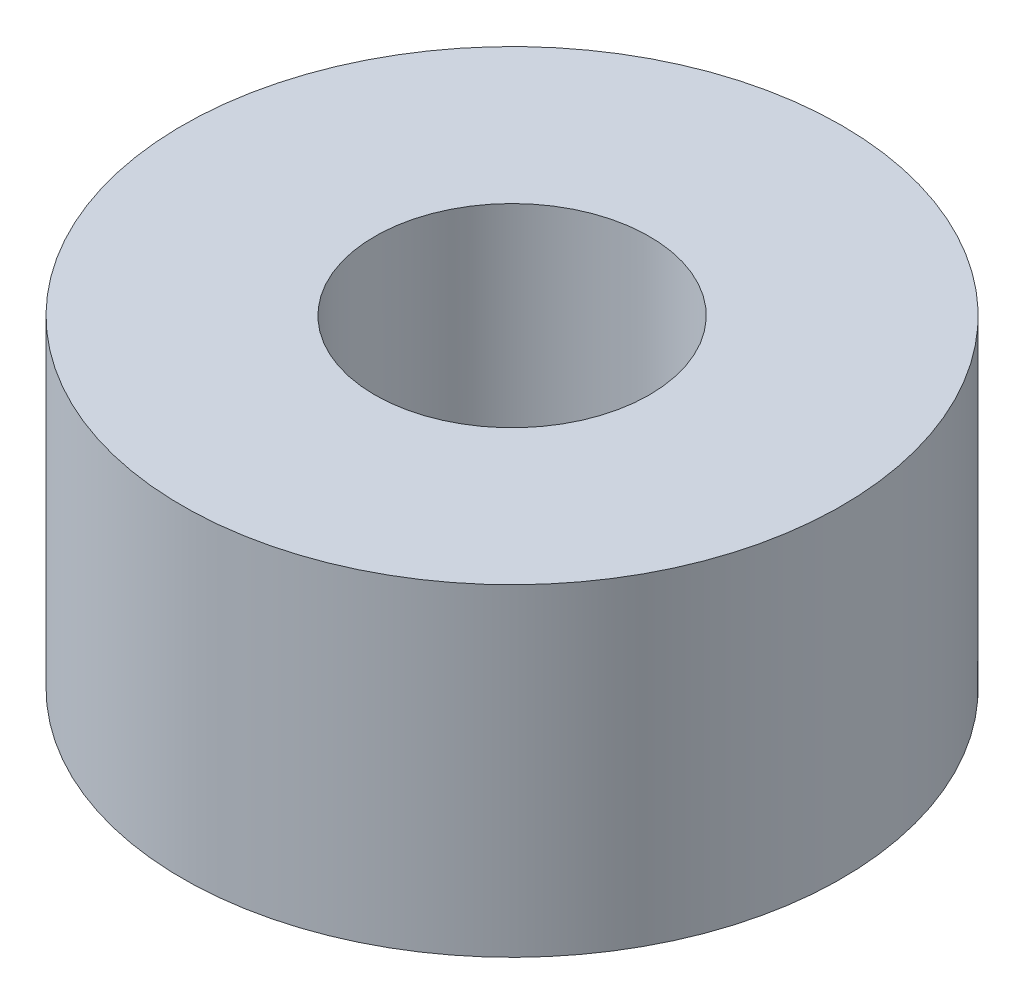
ISO-10303-21;
HEADER;
FILE_DESCRIPTION(('STEP AP214'),'2;1');
FILE_NAME('part.step','',(''),(''),'','','');
FILE_SCHEMA(('AUTOMOTIVE_DESIGN { 1 0 10303 214 1 1 1 1 }'));
ENDSEC;
DATA;
#1=APPLICATION_CONTEXT('core data for automotive mechanical design processes');
#2=APPLICATION_PROTOCOL_DEFINITION('international standard','automotive_design',2000,#1);
#3=PRODUCT_CONTEXT('',#1,'mechanical');
#4=PRODUCT('Part','Part','',(#3));
#5=PRODUCT_RELATED_PRODUCT_CATEGORY('part','',(#4));
#6=PRODUCT_DEFINITION_FORMATION('','',#4);
#7=PRODUCT_DEFINITION_CONTEXT('part definition',#1,'design');
#8=PRODUCT_DEFINITION('design','',#6,#7);
#9=PRODUCT_DEFINITION_SHAPE('','',#8);
#10=(LENGTH_UNIT() NAMED_UNIT(*) SI_UNIT(.MILLI.,.METRE.));
#11=(NAMED_UNIT(*) PLANE_ANGLE_UNIT() SI_UNIT($,.RADIAN.));
#12=(NAMED_UNIT(*) SI_UNIT($,.STERADIAN.) SOLID_ANGLE_UNIT());
#13=UNCERTAINTY_MEASURE_WITH_UNIT(LENGTH_MEASURE(1.E-05),#10,'distance_accuracy_value','');
#14=(GEOMETRIC_REPRESENTATION_CONTEXT(3) GLOBAL_UNCERTAINTY_ASSIGNED_CONTEXT((#13)) GLOBAL_UNIT_ASSIGNED_CONTEXT((#10,
#11,#12)) REPRESENTATION_CONTEXT('',''));
#15=CARTESIAN_POINT('',(0.,0.,0.));
#16=DIRECTION('',(0.,0.,1.));
#17=DIRECTION('',(1.,0.,0.));
#18=AXIS2_PLACEMENT_3D('',#15,#16,#17);
#19=CARTESIAN_POINT('',(-9.55182113959729E-12,5.2,0.));
#20=DIRECTION('',(0.,1.,0.));
#21=DIRECTION('',(0.,0.,1.));
#22=AXIS2_PLACEMENT_3D('',#19,#20,#21);
#23=PLANE('',#22);
#24=CARTESIAN_POINT('',(-9.55161176707587E-12,5.2,0.));
#25=DIRECTION('',(0.,1.,0.));
#26=DIRECTION('',(0.,0.,1.));
#27=AXIS2_PLACEMENT_3D('',#24,#25,#26);
#28=CIRCLE('',#27,2.);
#29=CARTESIAN_POINT('',(-9.55161176707587E-12,5.2,2.));
#30=VERTEX_POINT('',#29);
#31=EDGE_CURVE('E46',#30,#30,#28,.T.);
#32=ORIENTED_EDGE('',*,*,#31,.F.);
#33=EDGE_LOOP('',(#32));
#34=FACE_BOUND('',#33,.T.);
#35=CARTESIAN_POINT('',(-9.55182113959729E-12,5.2,0.));
#36=DIRECTION('',(0.,-1.,0.));
#37=DIRECTION('',(0.,0.,-1.));
#38=AXIS2_PLACEMENT_3D('',#35,#36,#37);
#39=CIRCLE('',#38,4.8);
#40=CARTESIAN_POINT('',(-9.55182113959729E-12,5.2,-4.8));
#41=VERTEX_POINT('',#40);
#42=EDGE_CURVE('E10',#41,#41,#39,.T.);
#43=ORIENTED_EDGE('',*,*,#42,.F.);
#44=EDGE_LOOP('',(#43));
#45=FACE_BOUND('',#44,.T.);
#46=ADVANCED_FACE('F32',(#34,#45),#23,.T.);
#47=CARTESIAN_POINT('',(-9.55182113959729E-12,0.,0.));
#48=DIRECTION('',(0.,-1.,0.));
#49=DIRECTION('',(0.,0.,-1.));
#50=AXIS2_PLACEMENT_3D('',#47,#48,#49);
#51=CYLINDRICAL_SURFACE('',#50,4.8);
#52=ORIENTED_EDGE('',*,*,#42,.T.);
#53=EDGE_LOOP('',(#52));
#54=FACE_BOUND('',#53,.T.);
#55=CARTESIAN_POINT('',(-9.55182113959729E-12,0.499999999999723,0.));
#56=DIRECTION('',(0.,-1.,0.));
#57=DIRECTION('',(0.,0.,-1.));
#58=AXIS2_PLACEMENT_3D('',#55,#56,#57);
#59=CIRCLE('',#58,4.8);
#60=CARTESIAN_POINT('',(-9.55182113959729E-12,0.499999999999723,-4.8));
#61=VERTEX_POINT('',#60);
#62=EDGE_CURVE('E38',#61,#61,#59,.T.);
#63=ORIENTED_EDGE('',*,*,#62,.F.);
#64=EDGE_LOOP('',(#63));
#65=FACE_BOUND('',#64,.T.);
#66=ADVANCED_FACE('F65',(#54,#65),#51,.T.);
#67=CARTESIAN_POINT('',(-9.55182113959729E-12,0.,0.));
#68=DIRECTION('',(0.,1.,0.));
#69=DIRECTION('',(0.,0.,1.));
#70=AXIS2_PLACEMENT_3D('',#67,#68,#69);
#71=CONICAL_SURFACE('',#70,2.8,1.32581766366816);
#72=ORIENTED_EDGE('',*,*,#62,.T.);
#73=EDGE_LOOP('',(#72));
#74=FACE_BOUND('',#73,.T.);
#75=CARTESIAN_POINT('',(-9.55182113959729E-12,0.,0.));
#76=DIRECTION('',(0.,-1.,0.));
#77=DIRECTION('',(0.,0.,-1.));
#78=AXIS2_PLACEMENT_3D('',#75,#76,#77);
#79=CIRCLE('',#78,2.8);
#80=CARTESIAN_POINT('',(-9.55182113959729E-12,0.,-2.8));
#81=VERTEX_POINT('',#80);
#82=EDGE_CURVE('E42',#81,#81,#79,.T.);
#83=ORIENTED_EDGE('',*,*,#82,.F.);
#84=EDGE_LOOP('',(#83));
#85=FACE_BOUND('',#84,.T.);
#86=ADVANCED_FACE('F60',(#74,#85),#71,.T.);
#87=CARTESIAN_POINT('',(2.79999999999045,0.,0.));
#88=DIRECTION('',(0.,-1.,0.));
#89=DIRECTION('',(0.,0.,-1.));
#90=AXIS2_PLACEMENT_3D('',#87,#88,#89);
#91=PLANE('',#90);
#92=CARTESIAN_POINT('',(-9.55182113959729E-12,0.,0.));
#93=DIRECTION('',(0.,-1.,0.));
#94=DIRECTION('',(1.,0.,0.));
#95=AXIS2_PLACEMENT_3D('',#92,#93,#94);
#96=CIRCLE('',#95,2.);
#97=CARTESIAN_POINT('',(1.99999999999045,0.,0.));
#98=VERTEX_POINT('',#97);
#99=EDGE_CURVE('E51',#98,#98,#96,.T.);
#100=ORIENTED_EDGE('',*,*,#99,.F.);
#101=EDGE_LOOP('',(#100));
#102=FACE_BOUND('',#101,.T.);
#103=ORIENTED_EDGE('',*,*,#82,.T.);
#104=EDGE_LOOP('',(#103));
#105=FACE_BOUND('',#104,.T.);
#106=ADVANCED_FACE('F57',(#102,#105),#91,.T.);
#107=CARTESIAN_POINT('',(-9.55141850013301E-12,10.,0.));
#108=DIRECTION('',(0.,-1.,0.));
#109=DIRECTION('',(1.,0.,0.));
#110=AXIS2_PLACEMENT_3D('',#107,#108,#109);
#111=CYLINDRICAL_SURFACE('',#110,2.);
#112=ORIENTED_EDGE('',*,*,#31,.T.);
#113=EDGE_LOOP('',(#112));
#114=FACE_BOUND('',#113,.T.);
#115=ORIENTED_EDGE('',*,*,#99,.T.);
#116=EDGE_LOOP('',(#115));
#117=FACE_BOUND('',#116,.T.);
#118=ADVANCED_FACE('F55',(#114,#117),#111,.F.);
#119=CLOSED_SHELL('',(#46,#66,#86,#106,#118));
#120=MANIFOLD_SOLID_BREP('B2',#119);
#121=ADVANCED_BREP_SHAPE_REPRESENTATION('',(#18,#120),#14);
#122=SHAPE_DEFINITION_REPRESENTATION(#9,#121);
ENDSEC;
END-ISO-10303-21;
